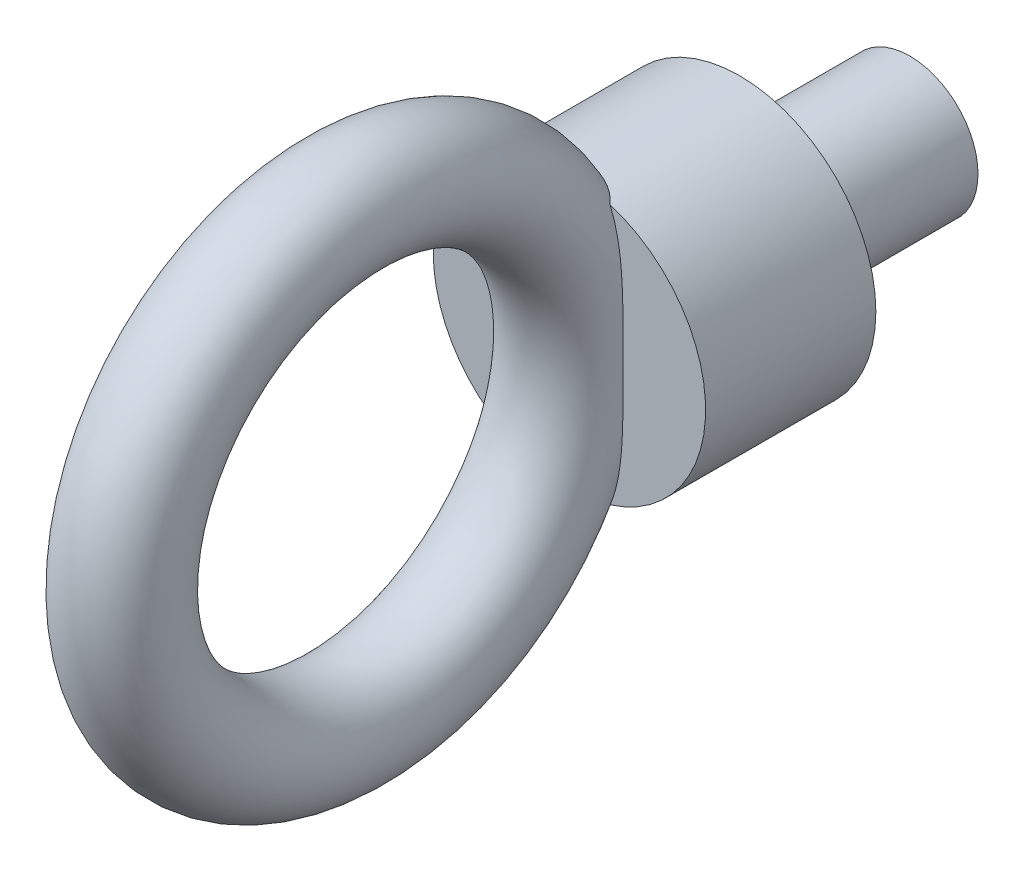
ISO-10303-21;
HEADER;
FILE_DESCRIPTION(('STEP AP214'),'2;1');
FILE_NAME('part.step','',(''),(''),'','','');
FILE_SCHEMA(('AUTOMOTIVE_DESIGN { 1 0 10303 214 1 1 1 1 }'));
ENDSEC;
DATA;
#1=APPLICATION_CONTEXT('core data for automotive mechanical design processes');
#2=APPLICATION_PROTOCOL_DEFINITION('international standard','automotive_design',2000,#1);
#3=PRODUCT_CONTEXT('',#1,'mechanical');
#4=PRODUCT('Part','Part','',(#3));
#5=PRODUCT_RELATED_PRODUCT_CATEGORY('part','',(#4));
#6=PRODUCT_DEFINITION_FORMATION('','',#4);
#7=PRODUCT_DEFINITION_CONTEXT('part definition',#1,'design');
#8=PRODUCT_DEFINITION('design','',#6,#7);
#9=PRODUCT_DEFINITION_SHAPE('','',#8);
#10=(LENGTH_UNIT() NAMED_UNIT(*) SI_UNIT(.MILLI.,.METRE.));
#11=(NAMED_UNIT(*) PLANE_ANGLE_UNIT() SI_UNIT($,.RADIAN.));
#12=(NAMED_UNIT(*) SI_UNIT($,.STERADIAN.) SOLID_ANGLE_UNIT());
#13=UNCERTAINTY_MEASURE_WITH_UNIT(LENGTH_MEASURE(1.E-05),#10,'distance_accuracy_value','');
#14=(GEOMETRIC_REPRESENTATION_CONTEXT(3) GLOBAL_UNCERTAINTY_ASSIGNED_CONTEXT((#13)) GLOBAL_UNIT_ASSIGNED_CONTEXT((#10,
#11,#12)) REPRESENTATION_CONTEXT('',''));
#15=CARTESIAN_POINT('',(0.,0.,0.));
#16=DIRECTION('',(0.,0.,1.));
#17=DIRECTION('',(1.,0.,0.));
#18=AXIS2_PLACEMENT_3D('',#15,#16,#17);
#19=CARTESIAN_POINT('',(0.,0.,20.));
#20=DIRECTION('',(0.,0.,-1.));
#21=DIRECTION('',(-1.,0.,0.));
#22=AXIS2_PLACEMENT_3D('',#19,#20,#21);
#23=CYLINDRICAL_SURFACE('',#22,4.);
#24=CARTESIAN_POINT('',(0.,0.,10.));
#25=DIRECTION('',(0.,0.,-1.));
#26=DIRECTION('',(-1.,0.,0.));
#27=AXIS2_PLACEMENT_3D('',#24,#25,#26);
#28=CIRCLE('',#27,4.);
#29=CARTESIAN_POINT('',(-4.,0.,10.));
#30=VERTEX_POINT('',#29);
#31=EDGE_CURVE('E40',#30,#30,#28,.T.);
#32=ORIENTED_EDGE('',*,*,#31,.T.);
#33=EDGE_LOOP('',(#32));
#34=FACE_BOUND('',#33,.T.);
#35=CARTESIAN_POINT('',(0.,0.,0.));
#36=DIRECTION('',(0.,0.,1.));
#37=DIRECTION('',(1.,0.,0.));
#38=AXIS2_PLACEMENT_3D('',#35,#36,#37);
#39=CIRCLE('',#38,4.);
#40=CARTESIAN_POINT('',(4.,0.,0.));
#41=VERTEX_POINT('',#40);
#42=EDGE_CURVE('E67',#41,#41,#39,.T.);
#43=ORIENTED_EDGE('',*,*,#42,.T.);
#44=EDGE_LOOP('',(#43));
#45=FACE_BOUND('',#44,.T.);
#46=ADVANCED_FACE('F37',(#34,#45),#23,.T.);
#47=CARTESIAN_POINT('',(0.,0.,0.));
#48=DIRECTION('',(0.,0.,1.));
#49=DIRECTION('',(1.,0.,0.));
#50=AXIS2_PLACEMENT_3D('',#47,#48,#49);
#51=PLANE('',#50);
#52=ORIENTED_EDGE('',*,*,#42,.F.);
#53=EDGE_LOOP('',(#52));
#54=FACE_BOUND('',#53,.T.);
#55=ADVANCED_FACE('F107',(#54),#51,.F.);
#56=CARTESIAN_POINT('',(0.,0.,10.));
#57=DIRECTION('',(0.,0.,-1.));
#58=DIRECTION('',(-1.,0.,0.));
#59=AXIS2_PLACEMENT_3D('',#56,#57,#58);
#60=PLANE('',#59);
#61=CARTESIAN_POINT('',(0.,0.,10.));
#62=DIRECTION('',(0.,0.,-1.));
#63=DIRECTION('',(-1.,0.,0.));
#64=AXIS2_PLACEMENT_3D('',#61,#62,#63);
#65=CIRCLE('',#64,8.);
#66=CARTESIAN_POINT('',(-8.,0.,10.));
#67=VERTEX_POINT('',#66);
#68=EDGE_CURVE('E78',#67,#67,#65,.T.);
#69=ORIENTED_EDGE('',*,*,#68,.T.);
#70=EDGE_LOOP('',(#69));
#71=FACE_BOUND('',#70,.T.);
#72=ORIENTED_EDGE('',*,*,#31,.F.);
#73=EDGE_LOOP('',(#72));
#74=FACE_BOUND('',#73,.T.);
#75=ADVANCED_FACE('F103',(#71,#74),#60,.T.);
#76=CARTESIAN_POINT('',(0.,0.,20.));
#77=DIRECTION('',(0.,0.,-1.));
#78=DIRECTION('',(-1.,0.,0.));
#79=AXIS2_PLACEMENT_3D('',#76,#77,#78);
#80=CYLINDRICAL_SURFACE('',#79,8.);
#81=ORIENTED_EDGE('',*,*,#68,.F.);
#82=EDGE_LOOP('',(#81));
#83=FACE_BOUND('',#82,.T.);
#84=CARTESIAN_POINT('',(2.38651451895567,7.63574151283382,20.0002));
#85=CARTESIAN_POINT('',(2.33138668605401,7.65297502105111,19.9361852549561));
#86=CARTESIAN_POINT('',(2.2734635023651,7.67041992196558,19.8746462066748));
#87=CARTESIAN_POINT('',(2.15246734548538,7.70524709280014,19.7568636117216));
#88=CARTESIAN_POINT('',(2.08939539162391,7.72262937440924,19.7006190216023));
#89=CARTESIAN_POINT('',(1.9586256544373,7.75682557823945,19.5938297807609));
#90=CARTESIAN_POINT('',(1.89093546801148,7.77364036895827,19.5432761151293));
#91=CARTESIAN_POINT('',(1.75135405672551,7.8062738483912,19.4480235126609));
#92=CARTESIAN_POINT('',(1.67946274805392,7.82209251721983,19.4033246926847));
#93=CARTESIAN_POINT('',(1.45824813728799,7.86740441667477,19.2783397094741));
#94=CARTESIAN_POINT('',(1.3032564170124,7.8947881344713,19.2070613806269));
#95=CARTESIAN_POINT('',(0.982867633576554,7.94104581365198,19.0898641041513));
#96=CARTESIAN_POINT('',(0.817469609217725,7.95991898762434,19.0439475029502));
#97=CARTESIAN_POINT('',(0.478414847680021,7.9875161674534,18.9775487291028));
#98=CARTESIAN_POINT('',(0.304675733585374,7.99609679445496,18.9574256105654));
#99=CARTESIAN_POINT('',(-0.044025862952915,8.00177999115945,18.9440486726618));
#100=CARTESIAN_POINT('',(-0.218988468970201,7.99888138423527,18.9507976076947));
#101=CARTESIAN_POINT('',(-0.566661322425202,7.98181810588691,18.9912554446826));
#102=CARTESIAN_POINT('',(-0.73934197159238,7.96756264573568,19.0251816185013));
#103=CARTESIAN_POINT('',(-1.07608657738014,7.92911056625843,19.1198314451121));
#104=CARTESIAN_POINT('',(-1.24014731089339,7.90491025783278,19.1805650428951));
#105=CARTESIAN_POINT('',(-1.55440371678893,7.84915223287391,19.3278109892175));
#106=CARTESIAN_POINT('',(-1.70464113748977,7.81761775753063,19.4142421409153));
#107=CARTESIAN_POINT('',(-1.91635161350943,7.76742571466833,19.5618452125908));
#108=CARTESIAN_POINT('',(-1.98461967300897,7.75022175380466,19.6140112863579));
#109=CARTESIAN_POINT('',(-2.11620859403002,7.71532730036298,19.7240812071765));
#110=CARTESIAN_POINT('',(-2.17953246629975,7.69763711288703,19.7819815128748));
#111=CARTESIAN_POINT('',(-2.26551631725225,7.67255742529053,19.8679268437661));
#112=CARTESIAN_POINT('',(-2.29041743604779,7.66515751958766,19.8937627703782));
#113=CARTESIAN_POINT('',(-2.33921529694871,7.65040648462319,19.9463181821485));
#114=CARTESIAN_POINT('',(-2.36311323531886,7.64305530660876,19.9730365428941));
#115=CARTESIAN_POINT('',(-2.38651451895575,7.63574151283383,20.0001999999999));
#116=B_SPLINE_CURVE_WITH_KNOTS('',3,(#84,#85,#86,#87,#88,#89,#90,#91,#92,#93,#94,#95,#96,#97,
#98,#99,#100,#101,#102,#103,#104,#105,#106,#107,#108,#109,#110,#111,#112,#113,#114,#115),
.UNSPECIFIED.,.F.,.F.,(4,2,2,2,2,2,2,2,2,2,2,2,2,2,2,4),(0.,0.258567697752766,0.517084329057937,
0.775185507471702,1.03329183670393,1.54900656670251,2.06476900182984,2.58763571971809,
3.11055603308897,3.63769912662408,4.16503794374753,4.6907279169903,4.95333523355097,
5.21578136832253,5.32567528050402,5.43543419161638),.UNSPECIFIED.);
#117=CARTESIAN_POINT('',(2.38634220596235,7.63579536630224,20.));
#118=VERTEX_POINT('',#117);
#119=CARTESIAN_POINT('',(-2.38634220596775,7.63579536630055,20.0000000000063));
#120=VERTEX_POINT('',#119);
#121=EDGE_CURVE('E11',#118,#120,#116,.T.);
#122=ORIENTED_EDGE('',*,*,#121,.F.);
#123=CARTESIAN_POINT('',(0.,0.,20.));
#124=DIRECTION('',(0.,0.,-1.));
#125=DIRECTION('',(-1.,0.,0.));
#126=AXIS2_PLACEMENT_3D('',#123,#124,#125);
#127=CIRCLE('',#126,8.);
#128=CARTESIAN_POINT('',(2.38634220596229,-7.63579536630226,20.));
#129=VERTEX_POINT('',#128);
#130=EDGE_CURVE('E66',#118,#129,#127,.T.);
#131=ORIENTED_EDGE('',*,*,#130,.T.);
#132=CARTESIAN_POINT('',(-2.38651451895567,-7.63574151283382,20.0002));
#133=CARTESIAN_POINT('',(-2.33138668605401,-7.65297502105111,19.9361852549561));
#134=CARTESIAN_POINT('',(-2.2734635023651,-7.67041992196558,19.8746462066748));
#135=CARTESIAN_POINT('',(-2.15246734548538,-7.70524709280014,19.7568636117216));
#136=CARTESIAN_POINT('',(-2.08939539162391,-7.72262937440924,19.7006190216023));
#137=CARTESIAN_POINT('',(-1.9586256544373,-7.75682557823945,19.5938297807609));
#138=CARTESIAN_POINT('',(-1.89093546801148,-7.77364036895827,19.5432761151293));
#139=CARTESIAN_POINT('',(-1.75135405672551,-7.8062738483912,19.4480235126609));
#140=CARTESIAN_POINT('',(-1.67946274805392,-7.82209251721983,19.4033246926847));
#141=CARTESIAN_POINT('',(-1.45824813728799,-7.86740441667478,19.2783397094741));
#142=CARTESIAN_POINT('',(-1.3032564170124,-7.8947881344713,19.2070613806269));
#143=CARTESIAN_POINT('',(-0.982867633576552,-7.94104581365198,19.0898641041513));
#144=CARTESIAN_POINT('',(-0.817469609217724,-7.95991898762434,19.0439475029502));
#145=CARTESIAN_POINT('',(-0.478414847680021,-7.9875161674534,18.9775487291028));
#146=CARTESIAN_POINT('',(-0.304675733585374,-7.99609679445496,18.9574256105654));
#147=CARTESIAN_POINT('',(0.0440258629529149,-8.00177999115945,18.9440486726618));
#148=CARTESIAN_POINT('',(0.218988468970201,-7.99888138423527,18.9507976076947));
#149=CARTESIAN_POINT('',(0.566661322425202,-7.98181810588691,18.9912554446826));
#150=CARTESIAN_POINT('',(0.739341971592381,-7.96756264573568,19.0251816185013));
#151=CARTESIAN_POINT('',(1.07608657738014,-7.92911056625843,19.1198314451121));
#152=CARTESIAN_POINT('',(1.24014731089339,-7.90491025783278,19.1805650428951));
#153=CARTESIAN_POINT('',(1.55440371678893,-7.84915223287391,19.3278109892175));
#154=CARTESIAN_POINT('',(1.70464113748977,-7.81761775753063,19.4142421409153));
#155=CARTESIAN_POINT('',(1.91635161350943,-7.76742571466833,19.5618452125908));
#156=CARTESIAN_POINT('',(1.98461967300897,-7.75022175380466,19.6140112863579));
#157=CARTESIAN_POINT('',(2.11620859403002,-7.71532730036298,19.7240812071765));
#158=CARTESIAN_POINT('',(2.17953246629975,-7.69763711288703,19.7819815128748));
#159=CARTESIAN_POINT('',(2.26551631725225,-7.67255742529053,19.8679268437661));
#160=CARTESIAN_POINT('',(2.29041743604779,-7.66515751958766,19.8937627703782));
#161=CARTESIAN_POINT('',(2.33921529694871,-7.65040648462319,19.9463181821484));
#162=CARTESIAN_POINT('',(2.36311323531886,-7.64305530660876,19.9730365428941));
#163=CARTESIAN_POINT('',(2.38651451895575,-7.63574151283383,20.0001999999999));
#164=B_SPLINE_CURVE_WITH_KNOTS('',3,(#132,#133,#134,#135,#136,#137,#138,#139,#140,#141,#142,
#143,#144,#145,#146,#147,#148,#149,#150,#151,#152,#153,#154,#155,#156,#157,#158,#159,#160,#161,
#162,#163),.UNSPECIFIED.,.F.,.F.,(4,2,2,2,2,2,2,2,2,2,2,2,2,2,2,4),(0.,0.258567697752765,
0.517084329057936,0.775185507471702,1.03329183670393,1.54900656670251,2.06476900182984,
2.58763571971809,3.11055603308897,3.63769912662408,4.16503794374753,4.6907279169903,
4.95333523355097,5.21578136832253,5.32567528050402,5.43543419161638),.UNSPECIFIED.);
#165=CARTESIAN_POINT('',(-2.38634220596235,-7.63579536630224,20.));
#166=VERTEX_POINT('',#165);
#167=EDGE_CURVE('E45',#166,#129,#164,.T.);
#168=ORIENTED_EDGE('',*,*,#167,.F.);
#169=EDGE_CURVE('E75',#166,#120,#127,.T.);
#170=ORIENTED_EDGE('',*,*,#169,.T.);
#171=EDGE_LOOP('',(#122,#131,#168,#170));
#172=FACE_BOUND('',#171,.T.);
#173=ADVANCED_FACE('F74',(#83,#172),#80,.T.);
#174=CARTESIAN_POINT('',(0.,0.,33.15));
#175=DIRECTION('',(-1.,0.,0.));
#176=DIRECTION('',(0.,0.,1.));
#177=AXIS2_PLACEMENT_3D('',#174,#175,#176);
#178=TOROIDAL_SURFACE('',#177,13.15,3.15);
#179=ORIENTED_EDGE('',*,*,#121,.T.);
#180=CARTESIAN_POINT('',(0.,-9.63158865400728,20.));
#181=CARTESIAN_POINT('',(-0.0620194823790943,-9.63158756446361,20.));
#182=CARTESIAN_POINT('',(-0.12405132791817,-9.62847839913677,20.));
#183=CARTESIAN_POINT('',(-0.247514871334145,-9.61613343989861,20.));
#184=CARTESIAN_POINT('',(-0.308946170871845,-9.60689382695286,20.));
#185=CARTESIAN_POINT('',(-0.491672280860368,-9.57021891901718,20.));
#186=CARTESIAN_POINT('',(-0.611268734031371,-9.53382818093301,20.));
#187=CARTESIAN_POINT('',(-0.840815540973837,-9.44086488389046,20.));
#188=CARTESIAN_POINT('',(-0.950843429517903,-9.38447804233952,20.));
#189=CARTESIAN_POINT('',(-1.16072596664339,-9.25535867209858,20.));
#190=CARTESIAN_POINT('',(-1.26057752851914,-9.18262120522081,20.));
#191=CARTESIAN_POINT('',(-1.49337737053924,-8.98773065017274,20.));
#192=CARTESIAN_POINT('',(-1.62020516044876,-8.85830264879578,20.));
#193=CARTESIAN_POINT('',(-1.8520375412178,-8.58128258785828,20.));
#194=CARTESIAN_POINT('',(-1.95699726450693,-8.43365415401007,20.));
#195=CARTESIAN_POINT('',(-2.13085066921103,-8.15343373107578,20.));
#196=CARTESIAN_POINT('',(-2.20284169386306,-8.02272135257239,20.));
#197=CARTESIAN_POINT('',(-2.33523469232584,-7.75547943481616,20.));
#198=CARTESIAN_POINT('',(-2.39562744774576,-7.61894537290136,20.));
#199=CARTESIAN_POINT('',(-2.50634726646343,-7.34158334409246,20.));
#200=CARTESIAN_POINT('',(-2.55665350708559,-7.20074717230581,20.));
#201=CARTESIAN_POINT('',(-2.6483696381566,-6.91634964423014,20.));
#202=CARTESIAN_POINT('',(-2.68978579367859,-6.77279028520875,20.));
#203=CARTESIAN_POINT('',(-2.76621267468599,-6.47895133793904,20.));
#204=CARTESIAN_POINT('',(-2.80096793194201,-6.32860601449086,20.));
#205=CARTESIAN_POINT('',(-2.86350538614385,-6.02645891741702,20.));
#206=CARTESIAN_POINT('',(-2.89128599365407,-5.87465681997889,20.));
#207=CARTESIAN_POINT('',(-2.96580899860331,-5.41751851945861,20.));
#208=CARTESIAN_POINT('',(-3.0036626749636,-5.1107370741111,20.));
#209=CARTESIAN_POINT('',(-3.06290734504588,-4.49426675717804,20.));
#210=CARTESIAN_POINT('',(-3.08421815480557,-4.18457099893417,20.));
#211=CARTESIAN_POINT('',(-3.11580055247807,-3.56480955576129,20.));
#212=CARTESIAN_POINT('',(-3.12607734690576,-3.254744114478,20.));
#213=CARTESIAN_POINT('',(-3.14023113508517,-2.63158847394686,20.));
#214=CARTESIAN_POINT('',(-3.14404719021512,-2.31849718520973,20.));
#215=CARTESIAN_POINT('',(-3.1486107765124,-1.69227471076375,20.));
#216=CARTESIAN_POINT('',(-3.14935805475527,-1.3791435238934,20.));
#217=CARTESIAN_POINT('',(-3.15005024918047,-0.75371201430549,20.));
#218=CARTESIAN_POINT('',(-3.14999728767219,-0.441411690109496,20.));
#219=CARTESIAN_POINT('',(-3.15000258472102,0.18318012502281,20.));
#220=CARTESIAN_POINT('',(-3.15006084007094,0.495471615954147,20.));
#221=CARTESIAN_POINT('',(-3.14979769500871,1.01441826966944,20.));
#222=CARTESIAN_POINT('',(-3.1495980520036,1.22107344699052,20.));
#223=CARTESIAN_POINT('',(-3.14850578260903,1.6343816980641,20.));
#224=CARTESIAN_POINT('',(-3.14761315938155,1.8410347718219,20.));
#225=CARTESIAN_POINT('',(-3.1444071897317,2.25456369204372,20.));
#226=CARTESIAN_POINT('',(-3.14209225040893,2.46143952831111,20.));
#227=CARTESIAN_POINT('',(-3.13506764477077,2.8751582926331,20.));
#228=CARTESIAN_POINT('',(-3.1303579370096,3.08200122005617,20.));
#229=CARTESIAN_POINT('',(-3.1173624230312,3.49511281557796,20.));
#230=CARTESIAN_POINT('',(-3.10908474819756,3.70138172248042,20.));
#231=CARTESIAN_POINT('',(-3.08754560482088,4.11366225496596,20.));
#232=CARTESIAN_POINT('',(-3.07428435806609,4.31967389158927,20.));
#233=CARTESIAN_POINT('',(-3.04115910814655,4.73091034447075,20.));
#234=CARTESIAN_POINT('',(-3.02130386889671,4.93613584129541,20.));
#235=CARTESIAN_POINT('',(-2.97308838356635,5.34565857929405,20.));
#236=CARTESIAN_POINT('',(-2.9447263173262,5.54995561230352,20.));
#237=CARTESIAN_POINT('',(-2.87665067142026,5.96074977251105,20.));
#238=CARTESIAN_POINT('',(-2.83672848545225,6.16721321485923,20.));
#239=CARTESIAN_POINT('',(-2.74306686727168,6.57693097221813,20.));
#240=CARTESIAN_POINT('',(-2.68933576152904,6.78018714302337,20.));
#241=CARTESIAN_POINT('',(-2.56519436131832,7.1803776127973,20.));
#242=CARTESIAN_POINT('',(-2.49488044462123,7.37734124075506,20.));
#243=CARTESIAN_POINT('',(-2.33380554361996,7.76258224381459,20.));
#244=CARTESIAN_POINT('',(-2.24308158755709,7.95087461435323,20.));
#245=CARTESIAN_POINT('',(-2.06699051851482,8.26082886578539,20.));
#246=CARTESIAN_POINT('',(-1.98773857875601,8.38594319838165,20.));
#247=CARTESIAN_POINT('',(-1.8152220746275,8.62644579591101,20.));
#248=CARTESIAN_POINT('',(-1.72194528461136,8.74182543662463,20.));
#249=CARTESIAN_POINT('',(-1.51927706601799,8.95969076610287,20.));
#250=CARTESIAN_POINT('',(-1.40974448851832,9.06204724103626,20.));
#251=CARTESIAN_POINT('',(-1.17495197079477,9.24686092542978,20.));
#252=CARTESIAN_POINT('',(-1.04972220949214,9.32935545496016,20.));
#253=CARTESIAN_POINT('',(-0.818416975455684,9.45048310660853,20.));
#254=CARTESIAN_POINT('',(-0.715393511361004,9.49492648882365,20.));
#255=CARTESIAN_POINT('',(-0.503384727873633,9.56614399668843,20.));
#256=CARTESIAN_POINT('',(-0.394403965493356,9.59293142890737,20.));
#257=CARTESIAN_POINT('',(-0.172900345011887,9.6268995286304,20.));
#258=CARTESIAN_POINT('',(-0.0603642609497106,9.63399531555163,20.));
#259=CARTESIAN_POINT('',(0.164141373815351,9.6277353460847,20.));
#260=CARTESIAN_POINT('',(0.276110883487739,9.61437812919864,20.));
#261=CARTESIAN_POINT('',(0.489084382380136,9.56976375038989,20.));
#262=CARTESIAN_POINT('',(0.590337505846455,9.5396698470904,20.));
#263=CARTESIAN_POINT('',(0.787021500385958,9.46444020912997,20.));
#264=CARTESIAN_POINT('',(0.882451160496084,9.41930135846467,20.));
#265=CARTESIAN_POINT('',(1.1019800628908,9.29622975717551,20.));
#266=CARTESIAN_POINT('',(1.22275665915692,9.21237242318714,20.));
#267=CARTESIAN_POINT('',(1.44927755043067,9.02626855920023,20.));
#268=CARTESIAN_POINT('',(1.5549815014533,8.92397427585442,20.));
#269=CARTESIAN_POINT('',(1.80015095078726,8.65247900929458,20.));
#270=CARTESIAN_POINT('',(1.93056497205512,8.47515780193537,20.));
#271=CARTESIAN_POINT('',(2.16265346516308,8.10322223104417,20.));
#272=CARTESIAN_POINT('',(2.2643169451605,7.90860129079059,20.));
#273=CARTESIAN_POINT('',(2.43561302682253,7.5275782828751,20.));
#274=CARTESIAN_POINT('',(2.50734683094761,7.34209859357221,20.));
#275=CARTESIAN_POINT('',(2.63471507283653,6.96560230203757,20.));
#276=CARTESIAN_POINT('',(2.69033411262452,6.77458059473309,20.));
#277=CARTESIAN_POINT('',(2.7885757065598,6.38797526448202,20.));
#278=CARTESIAN_POINT('',(2.83111227428243,6.1923701878641,20.));
#279=CARTESIAN_POINT('',(2.88665054826548,5.8975387267826,20.));
#280=CARTESIAN_POINT('',(2.90378094242441,5.79905936242691,20.));
#281=CARTESIAN_POINT('',(2.93556695526138,5.601711320418,20.));
#282=CARTESIAN_POINT('',(2.95022282804817,5.50284268380749,20.));
#283=CARTESIAN_POINT('',(2.9951740588645,5.17438427814519,20.));
#284=CARTESIAN_POINT('',(3.02064450705861,4.94413072588749,20.));
#285=CARTESIAN_POINT('',(3.06256951776698,4.48278797068033,20.));
#286=CARTESIAN_POINT('',(3.07902144722528,4.25169854348944,20.));
#287=CARTESIAN_POINT('',(3.10531540684694,3.78889192794171,20.));
#288=CARTESIAN_POINT('',(3.1151497576901,3.55717432247838,20.));
#289=CARTESIAN_POINT('',(3.13021461981509,3.09362523670976,20.));
#290=CARTESIAN_POINT('',(3.13544557221156,2.86179376944571,20.));
#291=CARTESIAN_POINT('',(3.14300803637893,2.39694930120165,20.));
#292=CARTESIAN_POINT('',(3.14532516549442,2.16393609544916,20.));
#293=CARTESIAN_POINT('',(3.1483593659008,1.69789801190126,20.));
#294=CARTESIAN_POINT('',(3.14907640998995,1.46487313397478,20.));
#295=CARTESIAN_POINT('',(3.14987096102558,0.999010334953683,20.));
#296=CARTESIAN_POINT('',(3.14994898187889,0.766172414230473,20.));
#297=CARTESIAN_POINT('',(3.1500139137449,0.300499139139052,20.));
#298=CARTESIAN_POINT('',(3.15000082575365,0.067663784770612,20.));
#299=CARTESIAN_POINT('',(3.14999883344447,-0.39782650886832,20.));
#300=CARTESIAN_POINT('',(3.15000991039638,-0.630481448146046,20.));
#301=CARTESIAN_POINT('',(3.14973589074703,-1.09579451720154,20.));
#302=CARTESIAN_POINT('',(3.14945079012948,-1.3284526469798,20.));
#303=CARTESIAN_POINT('',(3.14784101410857,-1.79398204382946,20.));
#304=CARTESIAN_POINT('',(3.146515376471,-2.02685330880235,20.));
#305=CARTESIAN_POINT('',(3.14167990655143,-2.49257214385534,20.));
#306=CARTESIAN_POINT('',(3.13817012375354,-2.72541971435274,20.));
#307=CARTESIAN_POINT('',(3.12747937794349,-3.18975854727557,20.));
#308=CARTESIAN_POINT('',(3.12031869711365,-3.42125023078051,20.));
#309=CARTESIAN_POINT('',(3.10049361197988,-3.88404335392041,20.));
#310=CARTESIAN_POINT('',(3.08782854501059,-4.11534476728887,20.));
#311=CARTESIAN_POINT('',(3.05481791047636,-4.5770847701575,20.));
#312=CARTESIAN_POINT('',(3.03448342806099,-4.80752412247108,20.));
#313=CARTESIAN_POINT('',(2.98355791412661,-5.26724565372525,20.));
#314=CARTESIAN_POINT('',(2.9529706778695,-5.49652822903797,20.));
#315=CARTESIAN_POINT('',(2.9004087937522,-5.81858873408301,20.));
#316=CARTESIAN_POINT('',(2.8839623742788,-5.91227518819255,20.));
#317=CARTESIAN_POINT('',(2.84856813671868,-6.09918452568808,20.));
#318=CARTESIAN_POINT('',(2.8296200281615,-6.19240735393634,20.));
#319=CARTESIAN_POINT('',(2.76860905474727,-6.47135314034399,20.));
#320=CARTESIAN_POINT('',(2.7224032557639,-6.65620275487513,20.));
#321=CARTESIAN_POINT('',(2.61709156082889,-7.02057383903566,20.));
#322=CARTESIAN_POINT('',(2.55809670281155,-7.2001269269686,20.));
#323=CARTESIAN_POINT('',(2.42442989914071,-7.55319975390463,20.));
#324=CARTESIAN_POINT('',(2.34977537171432,-7.7267259487242,20.));
#325=CARTESIAN_POINT('',(2.18956927969626,-8.04894813900088,20.));
#326=CARTESIAN_POINT('',(2.10567243951121,-8.1984538282358,20.));
#327=CARTESIAN_POINT('',(1.91988362310045,-8.48659687412976,20.));
#328=CARTESIAN_POINT('',(1.81794247338965,-8.62520299792078,20.));
#329=CARTESIAN_POINT('',(1.59241522217919,-8.8873034575963,20.));
#330=CARTESIAN_POINT('',(1.46856766502146,-9.0105805719795,20.));
#331=CARTESIAN_POINT('',(1.267066762789,-9.17588700607093,20.));
#332=CARTESIAN_POINT('',(1.19735770240735,-9.2276778561673,20.));
#333=CARTESIAN_POINT('',(1.05285062294643,-9.32354276238678,20.));
#334=CARTESIAN_POINT('',(0.978056282257303,-9.36762231565012,20.));
#335=CARTESIAN_POINT('',(0.801891152915652,-9.45798706387398,20.));
#336=CARTESIAN_POINT('',(0.698995713223007,-9.50135711415597,20.));
#337=CARTESIAN_POINT('',(0.487552381940201,-9.57039239870722,20.));
#338=CARTESIAN_POINT('',(0.379018800775497,-9.59610030682289,20.));
#339=CARTESIAN_POINT('',(0.224632365791929,-9.61855530873102,20.));
#340=CARTESIAN_POINT('',(0.179859902373398,-9.62343401525854,20.));
#341=CARTESIAN_POINT('',(0.0900605078364751,-9.629951507878,20.));
#342=CARTESIAN_POINT('',(0.0450335131472361,-9.63158944514544,20.));
#343=CARTESIAN_POINT('',(0.,-9.63158865400728,20.));
#344=B_SPLINE_CURVE_WITH_KNOTS('',3,(#180,#181,#182,#183,#184,#185,#186,#187,#188,#189,#190,
#191,#192,#193,#194,#195,#196,#197,#198,#199,#200,#201,#202,#203,#204,#205,#206,#207,#208,#209,
#210,#211,#212,#213,#214,#215,#216,#217,#218,#219,#220,#221,#222,#223,#224,#225,#226,#227,#228,
#229,#230,#231,#232,#233,#234,#235,#236,#237,#238,#239,#240,#241,#242,#243,#244,#245,#246,#247,
#248,#249,#250,#251,#252,#253,#254,#255,#256,#257,#258,#259,#260,#261,#262,#263,#264,#265,#266,
#267,#268,#269,#270,#271,#272,#273,#274,#275,#276,#277,#278,#279,#280,#281,#282,#283,#284,#285,
#286,#287,#288,#289,#290,#291,#292,#293,#294,#295,#296,#297,#298,#299,#300,#301,#302,#303,#304,
#305,#306,#307,#308,#309,#310,#311,#312,#313,#314,#315,#316,#317,#318,#319,#320,#321,#322,#323,
#324,#325,#326,#327,#328,#329,#330,#331,#332,#333,#334,#335,#336,#337,#338,#339,#340,#341,#342,
#343),.UNSPECIFIED.,.T.,.F.,(4,2,2,2,2,2,2,2,2,2,2,2,2,2,2,2,2,2,2,2,2,2,2,2,2,2,2,2,2,2,2,2,2,
2,2,2,2,2,2,2,2,2,2,2,2,2,2,2,2,2,2,2,2,2,2,2,2,2,2,2,2,2,2,2,2,2,2,2,2,2,2,2,2,2,2,2,2,2,2,2,2,
4),(0.,0.185995550651287,0.372107078344221,0.744715082462503,1.11394934936647,1.48329528195557,
2.02389194096691,2.56558707193909,3.01263554847046,3.46003788513744,3.90835454227979,
4.35635421419193,4.81908818421558,5.28192751001151,6.20848888907164,7.13951378314735,
8.07009917011337,9.0094140541082,9.94880635361283,10.8857077366689,11.8225821024207,
12.4425476488665,13.0625103664962,13.6831686703576,14.3038377161969,14.9230996770425,
15.5423340815969,16.1607487486517,16.7792958290444,17.4097860955205,18.0398970787956,
18.6664324398709,19.2918401673685,19.7353673959361,20.1792835189078,20.6273080105739,
21.0744839888976,21.4097249254112,21.744712914725,22.0811426390837,22.4175963881691,
22.733153587654,23.0487761837946,23.4874152216942,23.9272071420694,24.5838456881465,
25.2407349404618,25.8364524034594,26.4327372230741,27.0328613487994,27.3327112915771,
27.6325304239951,28.3272330488272,29.0221383918683,29.7178487483965,30.4134924321273,
31.1125565104403,31.8116324728818,32.5101461784423,33.2086522475561,33.9066170993775,
34.6045914159901,35.3032119442464,36.0018166450923,36.6965819351537,37.3914308902175,
38.0852793558507,38.7788712627163,39.0641984877876,39.3495588713107,39.9207364989811,
40.487140593173,41.0529179863263,41.5661782895204,42.0808594656212,42.602158374707,
42.8622749923777,43.1222054187382,43.4557995520139,43.7885848203782,43.9236043297746,
44.0586591988944),.UNSPECIFIED.);
#345=EDGE_CURVE('E51',#166,#120,#344,.T.);
#346=ORIENTED_EDGE('',*,*,#345,.F.);
#347=ORIENTED_EDGE('',*,*,#167,.T.);
#348=EDGE_CURVE('E57',#118,#129,#344,.T.);
#349=ORIENTED_EDGE('',*,*,#348,.F.);
#350=EDGE_LOOP('',(#179,#346,#347,#349));
#351=FACE_BOUND('',#350,.T.);
#352=ADVANCED_FACE('F70',(#351),#178,.T.);
#353=CARTESIAN_POINT('',(0.,0.,20.));
#354=DIRECTION('',(0.,0.,1.));
#355=DIRECTION('',(1.,0.,0.));
#356=AXIS2_PLACEMENT_3D('',#353,#354,#355);
#357=PLANE('',#356);
#358=ORIENTED_EDGE('',*,*,#345,.T.);
#359=ORIENTED_EDGE('',*,*,#169,.F.);
#360=EDGE_LOOP('',(#358,#359));
#361=FACE_BOUND('',#360,.T.);
#362=ADVANCED_FACE('F91',(#361),#357,.T.);
#363=ORIENTED_EDGE('',*,*,#348,.T.);
#364=ORIENTED_EDGE('',*,*,#130,.F.);
#365=EDGE_LOOP('',(#363,#364));
#366=FACE_BOUND('',#365,.T.);
#367=ADVANCED_FACE('F64',(#366),#357,.T.);
#368=CLOSED_SHELL('',(#46,#55,#75,#173,#352,#362,#367));
#369=MANIFOLD_SOLID_BREP('B2',#368);
#370=ADVANCED_BREP_SHAPE_REPRESENTATION('',(#18,#369),#14);
#371=SHAPE_DEFINITION_REPRESENTATION(#9,#370);
ENDSEC;
END-ISO-10303-21;
